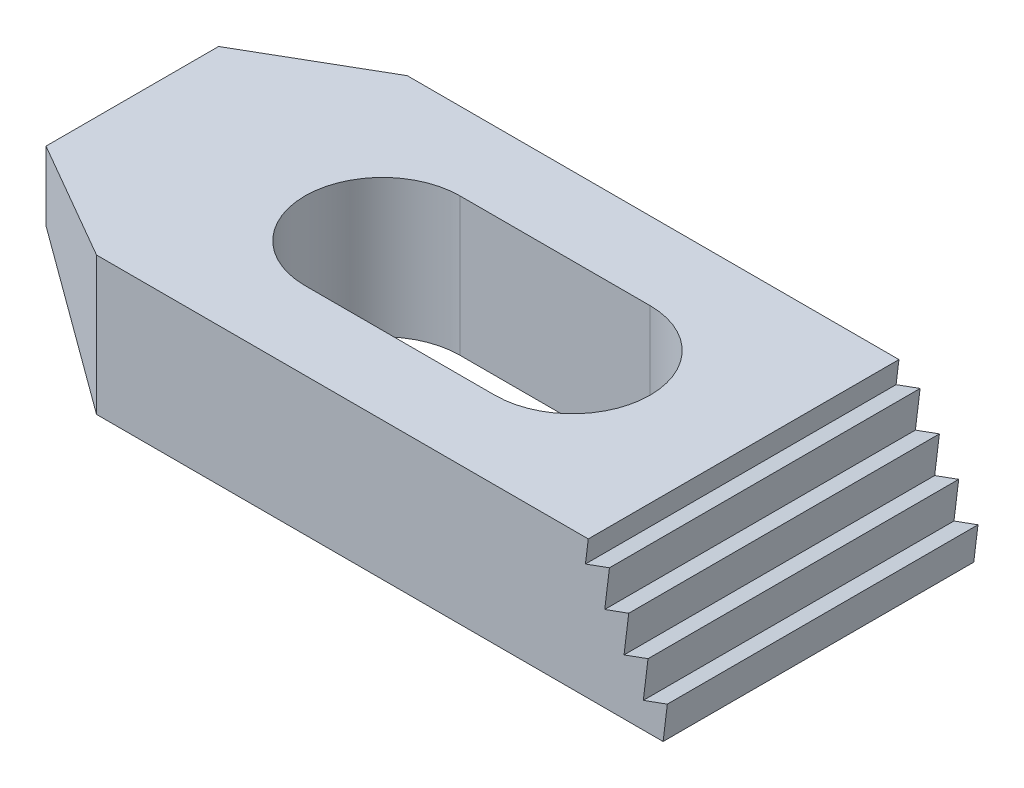
ISO-10303-21;
HEADER;
FILE_DESCRIPTION(('STEP AP214'),'2;1');
FILE_NAME('part.step','',(''),(''),'','','');
FILE_SCHEMA(('AUTOMOTIVE_DESIGN { 1 0 10303 214 1 1 1 1 }'));
ENDSEC;
DATA;
#1=APPLICATION_CONTEXT('core data for automotive mechanical design processes');
#2=APPLICATION_PROTOCOL_DEFINITION('international standard','automotive_design',2000,#1);
#3=PRODUCT_CONTEXT('',#1,'mechanical');
#4=PRODUCT('Part','Part','',(#3));
#5=PRODUCT_RELATED_PRODUCT_CATEGORY('part','',(#4));
#6=PRODUCT_DEFINITION_FORMATION('','',#4);
#7=PRODUCT_DEFINITION_CONTEXT('part definition',#1,'design');
#8=PRODUCT_DEFINITION('design','',#6,#7);
#9=PRODUCT_DEFINITION_SHAPE('','',#8);
#10=(LENGTH_UNIT() NAMED_UNIT(*) SI_UNIT(.MILLI.,.METRE.));
#11=(NAMED_UNIT(*) PLANE_ANGLE_UNIT() SI_UNIT($,.RADIAN.));
#12=(NAMED_UNIT(*) SI_UNIT($,.STERADIAN.) SOLID_ANGLE_UNIT());
#13=UNCERTAINTY_MEASURE_WITH_UNIT(LENGTH_MEASURE(1.E-05),#10,'distance_accuracy_value','');
#14=(GEOMETRIC_REPRESENTATION_CONTEXT(3) GLOBAL_UNCERTAINTY_ASSIGNED_CONTEXT((#13)) GLOBAL_UNIT_ASSIGNED_CONTEXT((#10,
#11,#12)) REPRESENTATION_CONTEXT('',''));
#15=CARTESIAN_POINT('',(0.,0.,0.));
#16=DIRECTION('',(0.,0.,1.));
#17=DIRECTION('',(1.,0.,0.));
#18=AXIS2_PLACEMENT_3D('',#15,#16,#17);
#19=CARTESIAN_POINT('',(15.4792734696389,4.21945945483052,20.6375000000455));
#20=DIRECTION('',(-0.342020143325669,0.939692620785908,1.51560712467597E-13));
#21=DIRECTION('',(0.939692620785908,0.342020143325669,2.41170064301584E-12));
#22=AXIS2_PLACEMENT_3D('',#19,#20,#21);
#23=PLANE('',#22);
#24=DIRECTION('',(2.21435561131981E-12,9.67329716156128E-13,-1.));
#25=VECTOR('',#24,1.);
#26=CARTESIAN_POINT('',(17.6882557184563,5.02346324142361,13.4937500000512));
#27=LINE('',#26,#25);
#28=CARTESIAN_POINT('',(17.6882557184404,5.02346324141671,20.6375000000512));
#29=VERTEX_POINT('',#28);
#30=CARTESIAN_POINT('',(17.6882557185037,5.02346324144434,-7.93749999994879));
#31=VERTEX_POINT('',#30);
#32=EDGE_CURVE('E11',#29,#31,#27,.T.);
#33=ORIENTED_EDGE('',*,*,#32,.T.);
#34=DIRECTION('',(0.939692620785908,0.342020143325669,2.41170064301584E-12));
#35=VECTOR('',#34,1.);
#36=CARTESIAN_POINT('',(4.10920070021008,0.0810914053223739,-7.93749999998365));
#37=LINE('',#36,#35);
#38=CARTESIAN_POINT('',(15.4792734697022,4.21945945485816,-7.93749999995446));
#39=VERTEX_POINT('',#38);
#40=EDGE_CURVE('E60',#39,#31,#37,.T.);
#41=ORIENTED_EDGE('',*,*,#40,.F.);
#42=DIRECTION('',(2.21446784457939E-12,9.67287921555165E-13,-1.));
#43=VECTOR('',#42,1.);
#44=CARTESIAN_POINT('',(15.4792734696389,4.21945945483052,20.6375000000455));
#45=LINE('',#44,#43);
#46=CARTESIAN_POINT('',(15.4792734696389,4.21945945483052,20.6375000000455));
#47=VERTEX_POINT('',#46);
#48=EDGE_CURVE('E255',#47,#39,#45,.T.);
#49=ORIENTED_EDGE('',*,*,#48,.F.);
#50=DIRECTION('',(-0.939692620785908,-0.342020143325669,-2.41170064301584E-12));
#51=VECTOR('',#50,1.);
#52=CARTESIAN_POINT('',(4.10920070014681,0.0810914052947267,20.6375000000164));
#53=LINE('',#52,#51);
#54=EDGE_CURVE('E272',#29,#47,#53,.T.);
#55=ORIENTED_EDGE('',*,*,#54,.F.);
#56=EDGE_LOOP('',(#33,#41,#49,#55));
#57=FACE_BOUND('',#56,.T.);
#58=ADVANCED_FACE('F41',(#57),#23,.T.);
#59=CARTESIAN_POINT('',(17.6882557184404,5.02346324141671,20.6375000000512));
#60=DIRECTION('',(0.992546151641322,-0.121869343405147,2.08007879318707E-12));
#61=DIRECTION('',(-0.121869343405147,-0.992546151641322,-1.22984262397695E-12));
#62=AXIS2_PLACEMENT_3D('',#59,#60,#61);
#63=PLANE('',#62);
#64=DIRECTION('',(-0.121869343405147,-0.992546151641322,-1.22984262397695E-12));
#65=VECTOR('',#64,1.);
#66=CARTESIAN_POINT('',(17.1881940681308,0.950787925462535,-7.93749999995384));
#67=LINE('',#66,#65);
#68=CARTESIAN_POINT('',(17.2539882302114,1.48663837438537,-7.93749999995318));
#69=VERTEX_POINT('',#68);
#70=EDGE_CURVE('E279',#31,#69,#67,.T.);
#71=ORIENTED_EDGE('',*,*,#70,.F.);
#72=ORIENTED_EDGE('',*,*,#32,.F.);
#73=DIRECTION('',(0.121869343405147,0.992546151641322,1.22984262397695E-12));
#74=VECTOR('',#73,1.);
#75=CARTESIAN_POINT('',(17.1881940680675,0.950787925434897,20.6375000000462));
#76=LINE('',#75,#74);
#77=CARTESIAN_POINT('',(17.2539882301481,1.48663837435774,20.6375000000468));
#78=VERTEX_POINT('',#77);
#79=EDGE_CURVE('E314',#78,#29,#76,.T.);
#80=ORIENTED_EDGE('',*,*,#79,.F.);
#81=DIRECTION('',(2.21446784457939E-12,9.67287921555165E-13,-1.));
#82=VECTOR('',#81,1.);
#83=CARTESIAN_POINT('',(17.2539882301481,1.48663837435774,20.6375000000468));
#84=LINE('',#83,#82);
#85=EDGE_CURVE('E51',#78,#69,#84,.T.);
#86=ORIENTED_EDGE('',*,*,#85,.T.);
#87=EDGE_LOOP('',(#71,#72,#80,#86));
#88=FACE_BOUND('',#87,.T.);
#89=ADVANCED_FACE('F338',(#88),#63,.T.);
#90=CARTESIAN_POINT('',(-8.73759999996851,2.59948312875125E-11,-7.93750000001217));
#91=DIRECTION('',(2.21445431436429E-12,9.67177726796109E-13,-1.));
#92=DIRECTION('',(0.,-1.,-9.67177726796109E-13));
#93=AXIS2_PLACEMENT_3D('',#90,#91,#92);
#94=PLANE('',#93);
#95=DIRECTION('',(-0.121869343405147,-0.992546151641322,-1.22984262397695E-12));
#96=VECTOR('',#95,1.);
#97=CARTESIAN_POINT('',(15.2613761468479,2.44482817180497,-7.93749999995666));
#98=LINE('',#97,#96);
#99=CARTESIAN_POINT('',(15.7408709550265,6.35000000002599,-7.93749999995182));
#100=VERTEX_POINT('',#99);
#101=EDGE_CURVE('E250',#100,#39,#98,.T.);
#102=ORIENTED_EDGE('',*,*,#101,.T.);
#103=ORIENTED_EDGE('',*,*,#40,.T.);
#104=ORIENTED_EDGE('',*,*,#70,.T.);
#105=DIRECTION('',(0.939692620785908,0.342020143325669,2.41170064301584E-12));
#106=VECTOR('',#105,1.);
#107=CARTESIAN_POINT('',(5.53951505799428,-2.77708117041166,-7.93749999998324));
#108=LINE('',#107,#106);
#109=CARTESIAN_POINT('',(19.462970479013,2.29064216097157,-7.93749999994751));
#110=VERTEX_POINT('',#109);
#111=EDGE_CURVE('E185',#69,#110,#108,.T.);
#112=ORIENTED_EDGE('',*,*,#111,.T.);
#113=DIRECTION('',(-0.121869343405147,-0.992546151641322,-1.22984262397695E-12));
#114=VECTOR('',#113,1.);
#115=CARTESIAN_POINT('',(19.1150119894137,-0.543252320879916,-7.93749999995102));
#116=LINE('',#115,#114);
#117=CARTESIAN_POINT('',(19.0287029907207,-1.24618270608741,-7.93749999995189));
#118=VERTEX_POINT('',#117);
#119=EDGE_CURVE('E183',#110,#118,#116,.T.);
#120=ORIENTED_EDGE('',*,*,#119,.T.);
#121=DIRECTION('',(0.939692620785908,0.342020143325669,2.41170064301584E-12));
#122=VECTOR('',#121,1.);
#123=CARTESIAN_POINT('',(6.96982941577839,-5.63525374614571,-7.93749999998284));
#124=LINE('',#123,#122);
#125=CARTESIAN_POINT('',(21.2376852395222,-0.442178919501226,-7.93749999994622));
#126=VERTEX_POINT('',#125);
#127=EDGE_CURVE('E163',#118,#126,#124,.T.);
#128=ORIENTED_EDGE('',*,*,#127,.T.);
#129=DIRECTION('',(-0.121869343405147,-0.992546151641322,-1.22984262397695E-12));
#130=VECTOR('',#129,1.);
#131=CARTESIAN_POINT('',(21.0418299106966,-2.03729256722236,-7.93749999994819));
#132=LINE('',#131,#130);
#133=CARTESIAN_POINT('',(20.8034177512299,-3.97900378656021,-7.9374999999506));
#134=VERTEX_POINT('',#133);
#135=EDGE_CURVE('E173',#126,#134,#132,.T.);
#136=ORIENTED_EDGE('',*,*,#135,.T.);
#137=DIRECTION('',(0.939692620785908,0.342020143325669,2.41170064301584E-12));
#138=VECTOR('',#137,1.);
#139=CARTESIAN_POINT('',(8.40014377356249,-8.4934263218797,-7.93749999998243));
#140=LINE('',#139,#138);
#141=CARTESIAN_POINT('',(23.0124000000315,-3.17499999997401,-7.93749999994493));
#142=VERTEX_POINT('',#141);
#143=EDGE_CURVE('E177',#134,#142,#140,.T.);
#144=ORIENTED_EDGE('',*,*,#143,.T.);
#145=DIRECTION('',(-0.121869343405147,-0.992546151641322,-1.22984262397695E-12));
#146=VECTOR('',#145,1.);
#147=CARTESIAN_POINT('',(22.9686478319795,-3.5313328135648,-7.93749999994537));
#148=LINE('',#147,#146);
#149=CARTESIAN_POINT('',(22.6225590191648,-6.34999999997401,-7.93749999994887));
#150=VERTEX_POINT('',#149);
#151=EDGE_CURVE('E202',#142,#150,#148,.T.);
#152=ORIENTED_EDGE('',*,*,#151,.T.);
#153=DIRECTION('',(1.,0.,2.21445431436429E-12));
#154=VECTOR('',#153,1.);
#155=CARTESIAN_POINT('',(-8.73759999996851,-6.34999999997401,-7.93750000001831));
#156=LINE('',#155,#154);
#157=CARTESIAN_POINT('',(-29.4890773719061,-6.34999999997401,-7.93750000006427));
#158=VERTEX_POINT('',#157);
#159=EDGE_CURVE('E203',#158,#150,#156,.T.);
#160=ORIENTED_EDGE('',*,*,#159,.F.);
#161=DIRECTION('',(0.,1.,9.67177726796109E-13));
#162=VECTOR('',#161,1.);
#163=CARTESIAN_POINT('',(-29.4890773719061,2.59948312875125E-11,-7.93750000005812));
#164=LINE('',#163,#162);
#165=CARTESIAN_POINT('',(-29.4890773719061,6.35000000002599,-7.93750000005198));
#166=VERTEX_POINT('',#165);
#167=EDGE_CURVE('E257',#158,#166,#164,.T.);
#168=ORIENTED_EDGE('',*,*,#167,.T.);
#169=DIRECTION('',(-1.,0.,-2.21445431436429E-12));
#170=VECTOR('',#169,1.);
#171=CARTESIAN_POINT('',(-8.73759999996851,6.35000000002599,-7.93750000000603));
#172=LINE('',#171,#170);
#173=EDGE_CURVE('E212',#100,#166,#172,.T.);
#174=ORIENTED_EDGE('',*,*,#173,.F.);
#175=EDGE_LOOP('',(#102,#103,#104,#112,#120,#128,#136,#144,#152,#160,#168,#174));
#176=FACE_BOUND('',#175,.T.);
#177=ADVANCED_FACE('F180',(#176),#94,.T.);
#178=CARTESIAN_POINT('',(15.9135409579312,7.75628432188949,20.6375000000499));
#179=DIRECTION('',(0.992546151641322,-0.121869343405147,2.08007879318707E-12));
#180=DIRECTION('',(-0.121869343405147,-0.992546151641322,-1.22984262397695E-12));
#181=AXIS2_PLACEMENT_3D('',#178,#179,#180);
#182=PLANE('',#181);
#183=DIRECTION('',(2.21445431436429E-12,9.67177726796109E-13,-1.));
#184=VECTOR('',#183,1.);
#185=CARTESIAN_POINT('',(15.740870954979,6.35000000000527,13.4937500000482));
#186=LINE('',#185,#184);
#187=CARTESIAN_POINT('',(15.7408709549632,6.34999999999836,20.6375000000482));
#188=VERTEX_POINT('',#187);
#189=EDGE_CURVE('E214',#188,#100,#186,.T.);
#190=ORIENTED_EDGE('',*,*,#189,.F.);
#191=DIRECTION('',(0.121869343405147,0.992546151641322,1.22984262397695E-12));
#192=VECTOR('',#191,1.);
#193=CARTESIAN_POINT('',(15.2613761467846,2.44482817177734,20.6375000000433));
#194=LINE('',#193,#192);
#195=EDGE_CURVE('E258',#47,#188,#194,.T.);
#196=ORIENTED_EDGE('',*,*,#195,.F.);
#197=ORIENTED_EDGE('',*,*,#48,.T.);
#198=ORIENTED_EDGE('',*,*,#101,.F.);
#199=EDGE_LOOP('',(#190,#196,#197,#198));
#200=FACE_BOUND('',#199,.T.);
#201=ADVANCED_FACE('F344',(#200),#182,.T.);
#202=CARTESIAN_POINT('',(-8.73760000003179,-1.64278313175004E-12,20.6374999999878));
#203=DIRECTION('',(-2.21445431436429E-12,-9.67177726796109E-13,1.));
#204=DIRECTION('',(0.,1.,9.67177726796109E-13));
#205=AXIS2_PLACEMENT_3D('',#202,#203,#204);
#206=PLANE('',#205);
#207=ORIENTED_EDGE('',*,*,#195,.T.);
#208=DIRECTION('',(1.,0.,2.21445431436429E-12));
#209=VECTOR('',#208,1.);
#210=CARTESIAN_POINT('',(-8.73760000003179,6.34999999999836,20.637499999994));
#211=LINE('',#210,#209);
#212=CARTESIAN_POINT('',(-29.4890773719694,6.34999999999836,20.637499999948));
#213=VERTEX_POINT('',#212);
#214=EDGE_CURVE('E208',#213,#188,#211,.T.);
#215=ORIENTED_EDGE('',*,*,#214,.F.);
#216=DIRECTION('',(0.,-1.,-9.67177726796109E-13));
#217=VECTOR('',#216,1.);
#218=CARTESIAN_POINT('',(-29.4890773719694,-1.64278313175004E-12,20.6374999999419));
#219=LINE('',#218,#217);
#220=CARTESIAN_POINT('',(-29.4890773719694,-6.35000000000164,20.6374999999357));
#221=VERTEX_POINT('',#220);
#222=EDGE_CURVE('E45',#213,#221,#219,.T.);
#223=ORIENTED_EDGE('',*,*,#222,.T.);
#224=DIRECTION('',(-1.,0.,-2.21445431436429E-12));
#225=VECTOR('',#224,1.);
#226=CARTESIAN_POINT('',(-8.73760000003179,-6.35000000000164,20.6374999999817));
#227=LINE('',#226,#225);
#228=CARTESIAN_POINT('',(22.6225590191015,-6.35000000000164,20.6375000000511));
#229=VERTEX_POINT('',#228);
#230=EDGE_CURVE('E251',#229,#221,#227,.T.);
#231=ORIENTED_EDGE('',*,*,#230,.F.);
#232=DIRECTION('',(0.121869343405147,0.992546151641322,1.22984262397695E-12));
#233=VECTOR('',#232,1.);
#234=CARTESIAN_POINT('',(22.9686478319162,-3.53133281359243,20.6375000000546));
#235=LINE('',#234,#233);
#236=CARTESIAN_POINT('',(23.0123999999682,-3.17500000000164,20.6375000000551));
#237=VERTEX_POINT('',#236);
#238=EDGE_CURVE('E303',#229,#237,#235,.T.);
#239=ORIENTED_EDGE('',*,*,#238,.T.);
#240=DIRECTION('',(-0.939692620785908,-0.342020143325669,-2.41170064301584E-12));
#241=VECTOR('',#240,1.);
#242=CARTESIAN_POINT('',(8.40014377349921,-8.49342632190734,20.6375000000176));
#243=LINE('',#242,#241);
#244=CARTESIAN_POINT('',(20.8034177511666,-3.97900378658784,20.6375000000494));
#245=VERTEX_POINT('',#244);
#246=EDGE_CURVE('E306',#237,#245,#243,.T.);
#247=ORIENTED_EDGE('',*,*,#246,.T.);
#248=DIRECTION('',(0.121869343405147,0.992546151641322,1.22984262397695E-12));
#249=VECTOR('',#248,1.);
#250=CARTESIAN_POINT('',(21.0418299106333,-2.03729256724999,20.6375000000518));
#251=LINE('',#250,#249);
#252=CARTESIAN_POINT('',(21.2376852394589,-0.442178919528863,20.6375000000538));
#253=VERTEX_POINT('',#252);
#254=EDGE_CURVE('E308',#245,#253,#251,.T.);
#255=ORIENTED_EDGE('',*,*,#254,.T.);
#256=DIRECTION('',(-0.939692620785908,-0.342020143325669,-2.41170064301584E-12));
#257=VECTOR('',#256,1.);
#258=CARTESIAN_POINT('',(6.96982941571511,-5.63525374617334,20.6375000000172));
#259=LINE('',#258,#257);
#260=CARTESIAN_POINT('',(19.0287029906574,-1.24618270611504,20.6375000000481));
#261=VERTEX_POINT('',#260);
#262=EDGE_CURVE('E165',#253,#261,#259,.T.);
#263=ORIENTED_EDGE('',*,*,#262,.T.);
#264=DIRECTION('',(0.121869343405147,0.992546151641322,1.22984262397695E-12));
#265=VECTOR('',#264,1.);
#266=CARTESIAN_POINT('',(19.1150119893504,-0.543252320907553,20.637500000049));
#267=LINE('',#266,#265);
#268=CARTESIAN_POINT('',(19.4629704789497,2.29064216094392,20.6375000000525));
#269=VERTEX_POINT('',#268);
#270=EDGE_CURVE('E189',#261,#269,#267,.T.);
#271=ORIENTED_EDGE('',*,*,#270,.T.);
#272=DIRECTION('',(-0.939692620785908,-0.342020143325669,-2.41170064301584E-12));
#273=VECTOR('',#272,1.);
#274=CARTESIAN_POINT('',(5.53951505793101,-2.77708117043929,20.6375000000168));
#275=LINE('',#274,#273);
#276=EDGE_CURVE('E322',#269,#78,#275,.T.);
#277=ORIENTED_EDGE('',*,*,#276,.T.);
#278=ORIENTED_EDGE('',*,*,#79,.T.);
#279=ORIENTED_EDGE('',*,*,#54,.T.);
#280=EDGE_LOOP('',(#207,#215,#223,#231,#239,#247,#255,#263,#271,#277,#278,#279));
#281=FACE_BOUND('',#280,.T.);
#282=ADVANCED_FACE('F330',(#281),#206,.T.);
#283=CARTESIAN_POINT('',(17.2539882301481,1.48663837435774,20.6375000000468));
#284=DIRECTION('',(-0.342020143325669,0.939692620785908,1.51560712467597E-13));
#285=DIRECTION('',(0.939692620785908,0.342020143325669,2.41170064301584E-12));
#286=AXIS2_PLACEMENT_3D('',#283,#284,#285);
#287=PLANE('',#286);
#288=DIRECTION('',(2.21435561131981E-12,9.67329716156128E-13,-1.));
#289=VECTOR('',#288,1.);
#290=CARTESIAN_POINT('',(19.4629704789655,2.29064216095083,13.4937500000525));
#291=LINE('',#290,#289);
#292=EDGE_CURVE('E270',#269,#110,#291,.T.);
#293=ORIENTED_EDGE('',*,*,#292,.T.);
#294=ORIENTED_EDGE('',*,*,#111,.F.);
#295=ORIENTED_EDGE('',*,*,#85,.F.);
#296=ORIENTED_EDGE('',*,*,#276,.F.);
#297=EDGE_LOOP('',(#293,#294,#295,#296));
#298=FACE_BOUND('',#297,.T.);
#299=ADVANCED_FACE('F376',(#298),#287,.T.);
#300=CARTESIAN_POINT('',(19.4629704789497,2.29064216094392,20.6375000000525));
#301=DIRECTION('',(0.992546151641322,-0.121869343405147,2.08007879318707E-12));
#302=DIRECTION('',(-0.121869343405147,-0.992546151641322,-1.22984262397695E-12));
#303=AXIS2_PLACEMENT_3D('',#300,#301,#302);
#304=PLANE('',#303);
#305=ORIENTED_EDGE('',*,*,#119,.F.);
#306=ORIENTED_EDGE('',*,*,#292,.F.);
#307=ORIENTED_EDGE('',*,*,#270,.F.);
#308=DIRECTION('',(2.21446784457939E-12,9.67287921555165E-13,-1.));
#309=VECTOR('',#308,1.);
#310=CARTESIAN_POINT('',(19.0287029906574,-1.24618270611504,20.6375000000481));
#311=LINE('',#310,#309);
#312=EDGE_CURVE('E169',#261,#118,#311,.T.);
#313=ORIENTED_EDGE('',*,*,#312,.T.);
#314=EDGE_LOOP('',(#305,#306,#307,#313));
#315=FACE_BOUND('',#314,.T.);
#316=ADVANCED_FACE('F379',(#315),#304,.T.);
#317=CARTESIAN_POINT('',(19.0287029906574,-1.24618270611504,20.6375000000481));
#318=DIRECTION('',(-0.342020143325669,0.939692620785908,1.51560712467597E-13));
#319=DIRECTION('',(0.939692620785908,0.342020143325669,2.41170064301584E-12));
#320=AXIS2_PLACEMENT_3D('',#317,#318,#319);
#321=PLANE('',#320);
#322=DIRECTION('',(2.21435561131981E-12,9.67329716156128E-13,-1.));
#323=VECTOR('',#322,1.);
#324=CARTESIAN_POINT('',(21.2376852394747,-0.442178919521954,13.4937500000538));
#325=LINE('',#324,#323);
#326=EDGE_CURVE('E159',#253,#126,#325,.T.);
#327=ORIENTED_EDGE('',*,*,#326,.T.);
#328=ORIENTED_EDGE('',*,*,#127,.F.);
#329=ORIENTED_EDGE('',*,*,#312,.F.);
#330=ORIENTED_EDGE('',*,*,#262,.F.);
#331=EDGE_LOOP('',(#327,#328,#329,#330));
#332=FACE_BOUND('',#331,.T.);
#333=ADVANCED_FACE('F161',(#332),#321,.T.);
#334=CARTESIAN_POINT('',(21.2376852394589,-0.442178919528863,20.6375000000538));
#335=DIRECTION('',(0.992546151641322,-0.121869343405147,2.08007879318707E-12));
#336=DIRECTION('',(-0.121869343405147,-0.992546151641322,-1.22984262397695E-12));
#337=AXIS2_PLACEMENT_3D('',#334,#335,#336);
#338=PLANE('',#337);
#339=ORIENTED_EDGE('',*,*,#135,.F.);
#340=ORIENTED_EDGE('',*,*,#326,.F.);
#341=ORIENTED_EDGE('',*,*,#254,.F.);
#342=DIRECTION('',(2.21446784457939E-12,9.67287921555165E-13,-1.));
#343=VECTOR('',#342,1.);
#344=CARTESIAN_POINT('',(20.8034177511666,-3.97900378658784,20.6375000000494));
#345=LINE('',#344,#343);
#346=EDGE_CURVE('E170',#245,#134,#345,.T.);
#347=ORIENTED_EDGE('',*,*,#346,.T.);
#348=EDGE_LOOP('',(#339,#340,#341,#347));
#349=FACE_BOUND('',#348,.T.);
#350=ADVANCED_FACE('F174',(#349),#338,.T.);
#351=CARTESIAN_POINT('',(20.8034177511666,-3.97900378658784,20.6375000000494));
#352=DIRECTION('',(-0.342020143325669,0.939692620785908,1.51560712467597E-13));
#353=DIRECTION('',(0.939692620785908,0.342020143325669,2.41170064301584E-12));
#354=AXIS2_PLACEMENT_3D('',#351,#352,#353);
#355=PLANE('',#354);
#356=DIRECTION('',(-2.21445431436429E-12,-9.67177726796109E-13,1.));
#357=VECTOR('',#356,1.);
#358=CARTESIAN_POINT('',(23.0123999999998,-3.17499999998782,6.35000000005507));
#359=LINE('',#358,#357);
#360=EDGE_CURVE('E284',#142,#237,#359,.T.);
#361=ORIENTED_EDGE('',*,*,#360,.F.);
#362=ORIENTED_EDGE('',*,*,#143,.F.);
#363=ORIENTED_EDGE('',*,*,#346,.F.);
#364=ORIENTED_EDGE('',*,*,#246,.F.);
#365=EDGE_LOOP('',(#361,#362,#363,#364));
#366=FACE_BOUND('',#365,.T.);
#367=ADVANCED_FACE('F388',(#366),#355,.T.);
#368=CARTESIAN_POINT('',(23.0123999999682,-3.17500000000164,20.6375000000551));
#369=DIRECTION('',(0.992546151641322,-0.121869343405147,2.08007879318707E-12));
#370=DIRECTION('',(-0.121869343405147,-0.992546151641322,-1.22984262397695E-12));
#371=AXIS2_PLACEMENT_3D('',#368,#369,#370);
#372=PLANE('',#371);
#373=DIRECTION('',(-2.21445431436429E-12,-9.67177726796109E-13,1.));
#374=VECTOR('',#373,1.);
#375=CARTESIAN_POINT('',(22.6225590191173,-6.34999999999473,13.4937500000511));
#376=LINE('',#375,#374);
#377=EDGE_CURVE('E253',#150,#229,#376,.T.);
#378=ORIENTED_EDGE('',*,*,#377,.F.);
#379=ORIENTED_EDGE('',*,*,#151,.F.);
#380=ORIENTED_EDGE('',*,*,#360,.T.);
#381=ORIENTED_EDGE('',*,*,#238,.F.);
#382=EDGE_LOOP('',(#378,#379,#380,#381));
#383=FACE_BOUND('',#382,.T.);
#384=ADVANCED_FACE('F300',(#383),#372,.T.);
#385=CARTESIAN_POINT('',(-8.73760000000015,-6.34999999998782,6.34999999998169));
#386=DIRECTION('',(0.,-1.,-9.67177726796109E-13));
#387=DIRECTION('',(-1.,0.,-2.21445431436429E-12));
#388=AXIS2_PLACEMENT_3D('',#385,#386,#387);
#389=PLANE('',#388);
#390=CARTESIAN_POINT('',(-17.4751999974602,-6.34999999998782,6.35000000250234));
#391=DIRECTION('',(0.,1.,9.67177726796109E-13));
#392=DIRECTION('',(-1.,0.,-3.5808664021605E-10));
#393=AXIS2_PLACEMENT_3D('',#390,#391,#392);
#394=CIRCLE('',#393,7.1374);
#395=CARTESIAN_POINT('',(-17.4751999999843,-6.34999999998092,-0.787399997497661));
#396=VERTEX_POINT('',#395);
#397=CARTESIAN_POINT('',(-17.475200000016,-6.34999999999473,13.4873999999623));
#398=VERTEX_POINT('',#397);
#399=EDGE_CURVE('E247',#396,#398,#394,.T.);
#400=ORIENTED_EDGE('',*,*,#399,.T.);
#401=DIRECTION('',(1.,0.,2.21445431436429E-12));
#402=VECTOR('',#401,1.);
#403=CARTESIAN_POINT('',(-13.106400000016,-6.34999999999473,13.487399999972));
#404=LINE('',#403,#402);
#405=CARTESIAN_POINT('',(-1.59594559789866E-11,-6.34999999999473,13.487399997461));
#406=VERTEX_POINT('',#405);
#407=EDGE_CURVE('E226',#398,#406,#404,.T.);
#408=ORIENTED_EDGE('',*,*,#407,.T.);
#409=CARTESIAN_POINT('',(-2.54015211642589E-09,-6.34999999998782,6.35000000254103));
#410=DIRECTION('',(0.,1.,9.67177726796109E-13));
#411=DIRECTION('',(3.58085778790091E-10,9.67177726796109E-13,-1.));
#412=AXIS2_PLACEMENT_3D('',#409,#410,#411);
#413=CIRCLE('',#412,7.1374);
#414=CARTESIAN_POINT('',(1.56541446472147E-11,-6.34999999998092,-0.787399999998963));
#415=VERTEX_POINT('',#414);
#416=EDGE_CURVE('E312',#406,#415,#413,.T.);
#417=ORIENTED_EDGE('',*,*,#416,.T.);
#418=DIRECTION('',(-1.,0.,-2.21445431436429E-12));
#419=VECTOR('',#418,1.);
#420=CARTESIAN_POINT('',(-4.36879999998435,-6.34999999998092,-0.787400000008638));
#421=LINE('',#420,#419);
#422=EDGE_CURVE('E317',#415,#396,#421,.T.);
#423=ORIENTED_EDGE('',*,*,#422,.T.);
#424=EDGE_LOOP('',(#400,#408,#417,#423));
#425=FACE_BOUND('',#424,.T.);
#426=ORIENTED_EDGE('',*,*,#377,.T.);
#427=ORIENTED_EDGE('',*,*,#230,.T.);
#428=DIRECTION('',(2.21445431436429E-12,9.67177726796109E-13,-1.));
#429=VECTOR('',#428,1.);
#430=CARTESIAN_POINT('',(-29.4890773719378,-6.34999999998782,6.34999999993574));
#431=LINE('',#430,#429);
#432=EDGE_CURVE('E206',#221,#158,#431,.T.);
#433=ORIENTED_EDGE('',*,*,#432,.T.);
#434=ORIENTED_EDGE('',*,*,#159,.T.);
#435=EDGE_LOOP('',(#426,#427,#433,#434));
#436=FACE_BOUND('',#435,.T.);
#437=ADVANCED_FACE('F290',(#425,#436),#389,.T.);
#438=CARTESIAN_POINT('',(-30.5229384989453,2.54171683700122E-11,-7.34060000006041));
#439=DIRECTION('',(-0.499999999998083,8.37600481380987E-13,-0.866025403785546));
#440=DIRECTION('',(0.866025403785546,4.835888633962E-13,-0.499999999998083));
#441=AXIS2_PLACEMENT_3D('',#438,#439,#440);
#442=PLANE('',#441);
#443=DIRECTION('',(-0.774596669242473,0.447213595499526,0.447213595498675));
#444=VECTOR('',#443,1.);
#445=CARTESIAN_POINT('',(-33.8906861276623,-3.80872999997646,-5.39623000007156));
#446=LINE('',#445,#444);
#447=CARTESIAN_POINT('',(-40.4875999999826,1.98530428208166E-11,-1.58750000008248));
#448=VERTEX_POINT('',#447);
#449=EDGE_CURVE('E207',#158,#448,#446,.T.);
#450=ORIENTED_EDGE('',*,*,#449,.T.);
#451=DIRECTION('',(0.,-1.,-9.67177726796109E-13));
#452=VECTOR('',#451,1.);
#453=CARTESIAN_POINT('',(-40.4875999999826,1.98530428208166E-11,-1.58750000008248));
#454=LINE('',#453,#452);
#455=CARTESIAN_POINT('',(-40.4875999999826,6.35000000001985,-1.58750000007634));
#456=VERTEX_POINT('',#455);
#457=EDGE_CURVE('E243',#456,#448,#454,.T.);
#458=ORIENTED_EDGE('',*,*,#457,.F.);
#459=DIRECTION('',(-0.866025403785546,-4.835888633962E-13,0.499999999998083));
#460=VECTOR('',#459,1.);
#461=CARTESIAN_POINT('',(-25.3175384100857,6.35000000002832,-10.3459391425817));
#462=LINE('',#461,#460);
#463=EDGE_CURVE('E215',#166,#456,#462,.T.);
#464=ORIENTED_EDGE('',*,*,#463,.F.);
#465=ORIENTED_EDGE('',*,*,#167,.F.);
#466=EDGE_LOOP('',(#450,#458,#464,#465));
#467=FACE_BOUND('',#466,.T.);
#468=ADVANCED_FACE('F296',(#467),#442,.T.);
#469=CARTESIAN_POINT('',(-8.73760000000015,6.35000000001218,6.34999999999397));
#470=DIRECTION('',(0.,1.,9.67177726796109E-13));
#471=DIRECTION('',(1.,0.,2.21445431436429E-12));
#472=AXIS2_PLACEMENT_3D('',#469,#470,#471);
#473=PLANE('',#472);
#474=DIRECTION('',(-1.,0.,-2.21445431436429E-12));
#475=VECTOR('',#474,1.);
#476=CARTESIAN_POINT('',(-13.106400000016,6.35000000000527,13.4873999999843));
#477=LINE('',#476,#475);
#478=CARTESIAN_POINT('',(-1.59594559789866E-11,6.35000000000527,13.4873999974733));
#479=VERTEX_POINT('',#478);
#480=CARTESIAN_POINT('',(-17.475200000016,6.35000000000527,13.4873999999746));
#481=VERTEX_POINT('',#480);
#482=EDGE_CURVE('E219',#479,#481,#477,.T.);
#483=ORIENTED_EDGE('',*,*,#482,.T.);
#484=CARTESIAN_POINT('',(-17.4751999974602,6.35000000001218,6.35000000251462));
#485=DIRECTION('',(0.,-1.,-9.67177726796109E-13));
#486=DIRECTION('',(-1.,0.,-3.5808664021605E-10));
#487=AXIS2_PLACEMENT_3D('',#484,#485,#486);
#488=CIRCLE('',#487,7.1374);
#489=CARTESIAN_POINT('',(-17.4751999999843,6.35000000001908,-0.787399997485378));
#490=VERTEX_POINT('',#489);
#491=EDGE_CURVE('E199',#481,#490,#488,.T.);
#492=ORIENTED_EDGE('',*,*,#491,.T.);
#493=DIRECTION('',(1.,0.,2.21445431436429E-12));
#494=VECTOR('',#493,1.);
#495=CARTESIAN_POINT('',(-4.36879999998435,6.35000000001908,-0.787399999996354));
#496=LINE('',#495,#494);
#497=CARTESIAN_POINT('',(1.56541446472147E-11,6.35000000001908,-0.78739999998668));
#498=VERTEX_POINT('',#497);
#499=EDGE_CURVE('E196',#490,#498,#496,.T.);
#500=ORIENTED_EDGE('',*,*,#499,.T.);
#501=CARTESIAN_POINT('',(-2.54015211642589E-09,6.35000000001218,6.34999999747332));
#502=DIRECTION('',(0.,-1.,-9.67177726796109E-13));
#503=DIRECTION('',(1.,0.,3.5808664021605E-10));
#504=AXIS2_PLACEMENT_3D('',#501,#502,#503);
#505=CIRCLE('',#504,7.13739999999999);
#506=EDGE_CURVE('E200',#498,#479,#505,.T.);
#507=ORIENTED_EDGE('',*,*,#506,.T.);
#508=EDGE_LOOP('',(#483,#492,#500,#507));
#509=FACE_BOUND('',#508,.T.);
#510=ORIENTED_EDGE('',*,*,#189,.T.);
#511=ORIENTED_EDGE('',*,*,#173,.T.);
#512=ORIENTED_EDGE('',*,*,#463,.T.);
#513=DIRECTION('',(-2.21445431436429E-12,-9.67177726796109E-13,1.));
#514=VECTOR('',#513,1.);
#515=CARTESIAN_POINT('',(-40.4876000000001,6.35000000001218,6.34999999992366));
#516=LINE('',#515,#514);
#517=CARTESIAN_POINT('',(-40.4876000000177,6.3500000000045,14.2874999999237));
#518=VERTEX_POINT('',#517);
#519=EDGE_CURVE('E221',#456,#518,#516,.T.);
#520=ORIENTED_EDGE('',*,*,#519,.T.);
#521=DIRECTION('',(0.866025403783331,-4.83588863399909E-13,0.500000000001918));
#522=VECTOR('',#521,1.);
#523=CARTESIAN_POINT('',(-25.3175384101596,6.34999999999603,23.0459391424963));
#524=LINE('',#523,#522);
#525=EDGE_CURVE('E210',#518,#213,#524,.T.);
#526=ORIENTED_EDGE('',*,*,#525,.T.);
#527=ORIENTED_EDGE('',*,*,#214,.T.);
#528=EDGE_LOOP('',(#510,#511,#512,#520,#526,#527));
#529=FACE_BOUND('',#528,.T.);
#530=ADVANCED_FACE('F345',(#509,#529),#473,.T.);
#531=CARTESIAN_POINT('',(-30.522938499006,-1.06512021424976E-12,20.0405999999396));
#532=DIRECTION('',(-0.500000000001918,-8.37600481378845E-13,0.866025403783332));
#533=DIRECTION('',(-0.866025403783332,4.83588863399909E-13,-0.500000000001918));
#534=AXIS2_PLACEMENT_3D('',#531,#532,#533);
#535=PLANE('',#534);
#536=DIRECTION('',(0.774596669240493,-0.447213595500391,0.447213595501241));
#537=VECTOR('',#536,1.);
#538=CARTESIAN_POINT('',(-33.8906861277144,-3.80872999999919,18.0962299999284));
#539=LINE('',#538,#537);
#540=CARTESIAN_POINT('',(-40.4876000000177,4.49900533494585E-12,14.2874999999175));
#541=VERTEX_POINT('',#540);
#542=EDGE_CURVE('E211',#541,#221,#539,.T.);
#543=ORIENTED_EDGE('',*,*,#542,.T.);
#544=ORIENTED_EDGE('',*,*,#222,.F.);
#545=ORIENTED_EDGE('',*,*,#525,.F.);
#546=DIRECTION('',(0.,1.,9.67177726796109E-13));
#547=VECTOR('',#546,1.);
#548=CARTESIAN_POINT('',(-40.4876000000177,4.49900533494585E-12,14.2874999999175));
#549=LINE('',#548,#547);
#550=EDGE_CURVE('E237',#541,#518,#549,.T.);
#551=ORIENTED_EDGE('',*,*,#550,.F.);
#552=EDGE_LOOP('',(#543,#544,#545,#551));
#553=FACE_BOUND('',#552,.T.);
#554=ADVANCED_FACE('F350',(#553),#535,.T.);
#555=CARTESIAN_POINT('',(-30.5229384989757,-5.75309999998782,6.34999999993402));
#556=DIRECTION('',(-0.5,-0.866025403784439,-1.94482763856206E-12));
#557=DIRECTION('',(-0.866025403784439,0.5,-1.43418482836147E-12));
#558=AXIS2_PLACEMENT_3D('',#555,#556,#557);
#559=PLANE('',#558);
#560=ORIENTED_EDGE('',*,*,#449,.F.);
#561=ORIENTED_EDGE('',*,*,#432,.F.);
#562=ORIENTED_EDGE('',*,*,#542,.F.);
#563=DIRECTION('',(-2.21445431436429E-12,-9.67177726796109E-13,1.));
#564=VECTOR('',#563,1.);
#565=CARTESIAN_POINT('',(-40.4876000000001,1.21760240778812E-11,6.34999999991752));
#566=LINE('',#565,#564);
#567=EDGE_CURVE('E230',#448,#541,#566,.T.);
#568=ORIENTED_EDGE('',*,*,#567,.F.);
#569=EDGE_LOOP('',(#560,#561,#562,#568));
#570=FACE_BOUND('',#569,.T.);
#571=ADVANCED_FACE('F351',(#570),#559,.T.);
#572=CARTESIAN_POINT('',(-17.4751999974601,6.35000000001218,6.34999999743463));
#573=DIRECTION('',(0.,-1.,-9.67177726796109E-13));
#574=DIRECTION('',(-1.,0.,-2.21445431436429E-12));
#575=AXIS2_PLACEMENT_3D('',#572,#573,#574);
#576=CYLINDRICAL_SURFACE('',#575,7.1374);
#577=DIRECTION('',(0.,-1.,-9.67177726796109E-13));
#578=VECTOR('',#577,1.);
#579=CARTESIAN_POINT('',(-17.475200000016,6.35000000000527,13.4873999999746));
#580=LINE('',#579,#578);
#581=EDGE_CURVE('E194',#481,#398,#580,.T.);
#582=ORIENTED_EDGE('',*,*,#581,.T.);
#583=ORIENTED_EDGE('',*,*,#399,.F.);
#584=DIRECTION('',(0.,-1.,-9.67177726796109E-13));
#585=VECTOR('',#584,1.);
#586=CARTESIAN_POINT('',(-17.4751999999843,6.35000000001908,-0.787399997485378));
#587=LINE('',#586,#585);
#588=EDGE_CURVE('E228',#490,#396,#587,.T.);
#589=ORIENTED_EDGE('',*,*,#588,.F.);
#590=ORIENTED_EDGE('',*,*,#491,.F.);
#591=EDGE_LOOP('',(#582,#583,#589,#590));
#592=FACE_BOUND('',#591,.T.);
#593=ADVANCED_FACE('F353',(#592),#576,.F.);
#594=CARTESIAN_POINT('',(-17.475200000016,6.35000000000527,13.4873999999746));
#595=DIRECTION('',(2.21445431436429E-12,9.67177726796109E-13,-1.));
#596=DIRECTION('',(0.,-1.,-9.67177726796109E-13));
#597=AXIS2_PLACEMENT_3D('',#594,#595,#596);
#598=PLANE('',#597);
#599=ORIENTED_EDGE('',*,*,#407,.F.);
#600=ORIENTED_EDGE('',*,*,#581,.F.);
#601=ORIENTED_EDGE('',*,*,#482,.F.);
#602=DIRECTION('',(0.,-1.,-9.67177726796109E-13));
#603=VECTOR('',#602,1.);
#604=CARTESIAN_POINT('',(-1.59594559789866E-11,6.35000000000527,13.4873999974733));
#605=LINE('',#604,#603);
#606=EDGE_CURVE('E191',#479,#406,#605,.T.);
#607=ORIENTED_EDGE('',*,*,#606,.T.);
#608=EDGE_LOOP('',(#599,#600,#601,#607));
#609=FACE_BOUND('',#608,.T.);
#610=ADVANCED_FACE('F359',(#609),#598,.T.);
#611=CARTESIAN_POINT('',(-2.54015211642589E-09,6.35000000001218,6.34999999747332));
#612=DIRECTION('',(0.,-1.,-9.67177726796109E-13));
#613=DIRECTION('',(-1.,0.,-2.21445431436429E-12));
#614=AXIS2_PLACEMENT_3D('',#611,#612,#613);
#615=CYLINDRICAL_SURFACE('',#614,7.13739999999999);
#616=ORIENTED_EDGE('',*,*,#416,.F.);
#617=ORIENTED_EDGE('',*,*,#606,.F.);
#618=ORIENTED_EDGE('',*,*,#506,.F.);
#619=DIRECTION('',(0.,-1.,-9.67177726796109E-13));
#620=VECTOR('',#619,1.);
#621=CARTESIAN_POINT('',(1.56541446472147E-11,6.35000000001908,-0.78739999998668));
#622=LINE('',#621,#620);
#623=EDGE_CURVE('E195',#498,#415,#622,.T.);
#624=ORIENTED_EDGE('',*,*,#623,.T.);
#625=EDGE_LOOP('',(#616,#617,#618,#624));
#626=FACE_BOUND('',#625,.T.);
#627=ADVANCED_FACE('F43',(#626),#615,.F.);
#628=CARTESIAN_POINT('',(1.56541446472147E-11,6.35000000001908,-0.78739999998668));
#629=DIRECTION('',(-2.21445431436429E-12,-9.67177726796109E-13,1.));
#630=DIRECTION('',(0.,1.,9.67177726796109E-13));
#631=AXIS2_PLACEMENT_3D('',#628,#629,#630);
#632=PLANE('',#631);
#633=ORIENTED_EDGE('',*,*,#422,.F.);
#634=ORIENTED_EDGE('',*,*,#623,.F.);
#635=ORIENTED_EDGE('',*,*,#499,.F.);
#636=ORIENTED_EDGE('',*,*,#588,.T.);
#637=EDGE_LOOP('',(#633,#634,#635,#636));
#638=FACE_BOUND('',#637,.T.);
#639=ADVANCED_FACE('F412',(#638),#632,.T.);
#640=CARTESIAN_POINT('',(-40.4876000000001,1.21760240778812E-11,6.34999999991752));
#641=DIRECTION('',(-1.,0.,-2.21445431436429E-12));
#642=DIRECTION('',(0.,1.,9.67177726796109E-13));
#643=AXIS2_PLACEMENT_3D('',#640,#641,#642);
#644=PLANE('',#643);
#645=ORIENTED_EDGE('',*,*,#567,.T.);
#646=ORIENTED_EDGE('',*,*,#550,.T.);
#647=ORIENTED_EDGE('',*,*,#519,.F.);
#648=ORIENTED_EDGE('',*,*,#457,.T.);
#649=EDGE_LOOP('',(#645,#646,#647,#648));
#650=FACE_BOUND('',#649,.T.);
#651=ADVANCED_FACE('F419',(#650),#644,.T.);
#652=CLOSED_SHELL('',(#58,#89,#177,#201,#282,#299,#316,#333,#350,#367,#384,#437,#468,#530,#554,
#571,#593,#610,#627,#639,#651));
#653=MANIFOLD_SOLID_BREP('B2',#652);
#654=ADVANCED_BREP_SHAPE_REPRESENTATION('',(#18,#653),#14);
#655=SHAPE_DEFINITION_REPRESENTATION(#9,#654);
ENDSEC;
END-ISO-10303-21;
